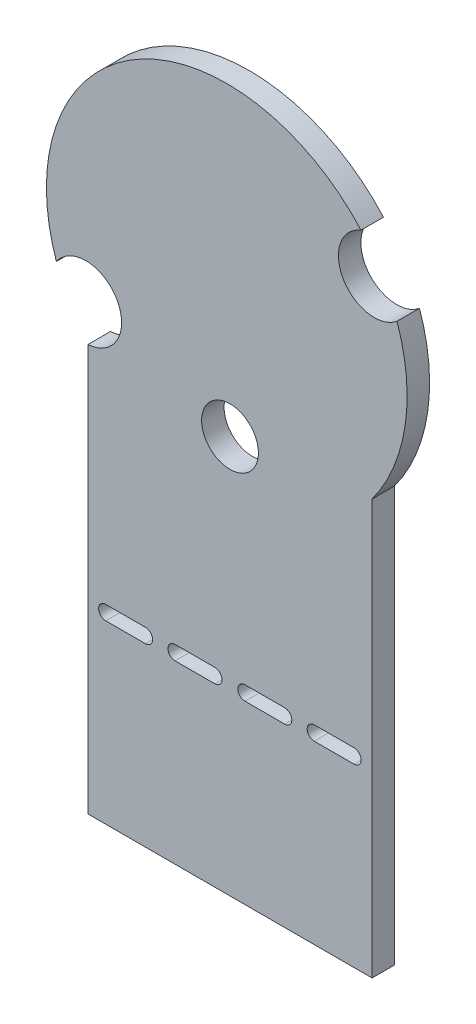
ISO-10303-21;
HEADER;
FILE_DESCRIPTION(('STEP AP214'),'2;1');
FILE_NAME('part.step','',(''),(''),'','','');
FILE_SCHEMA(('AUTOMOTIVE_DESIGN { 1 0 10303 214 1 1 1 1 }'));
ENDSEC;
DATA;
#1=APPLICATION_CONTEXT('core data for automotive mechanical design processes');
#2=APPLICATION_PROTOCOL_DEFINITION('international standard','automotive_design',2000,#1);
#3=PRODUCT_CONTEXT('',#1,'mechanical');
#4=PRODUCT('Part','Part','',(#3));
#5=PRODUCT_RELATED_PRODUCT_CATEGORY('part','',(#4));
#6=PRODUCT_DEFINITION_FORMATION('','',#4);
#7=PRODUCT_DEFINITION_CONTEXT('part definition',#1,'design');
#8=PRODUCT_DEFINITION('design','',#6,#7);
#9=PRODUCT_DEFINITION_SHAPE('','',#8);
#10=(LENGTH_UNIT() NAMED_UNIT(*) SI_UNIT(.MILLI.,.METRE.));
#11=(NAMED_UNIT(*) PLANE_ANGLE_UNIT() SI_UNIT($,.RADIAN.));
#12=(NAMED_UNIT(*) SI_UNIT($,.STERADIAN.) SOLID_ANGLE_UNIT());
#13=UNCERTAINTY_MEASURE_WITH_UNIT(LENGTH_MEASURE(1.E-05),#10,'distance_accuracy_value','');
#14=(GEOMETRIC_REPRESENTATION_CONTEXT(3) GLOBAL_UNCERTAINTY_ASSIGNED_CONTEXT((#13)) GLOBAL_UNIT_ASSIGNED_CONTEXT((#10,
#11,#12)) REPRESENTATION_CONTEXT('',''));
#15=CARTESIAN_POINT('',(0.,0.,0.));
#16=DIRECTION('',(0.,0.,1.));
#17=DIRECTION('',(1.,0.,0.));
#18=AXIS2_PLACEMENT_3D('',#15,#16,#17);
#19=CARTESIAN_POINT('',(100.144566,-105.536604,0.));
#20=DIRECTION('',(0.,0.,-1.));
#21=DIRECTION('',(1.,0.,0.));
#22=AXIS2_PLACEMENT_3D('',#19,#20,#21);
#23=CYLINDRICAL_SURFACE('',#22,1.27);
#24=DIRECTION('',(0.,0.,1.));
#25=VECTOR('',#24,1.);
#26=CARTESIAN_POINT('',(101.414566,-105.536604,0.));
#27=LINE('',#26,#25);
#28=CARTESIAN_POINT('',(101.414566,-105.536604,0.));
#29=VERTEX_POINT('',#28);
#30=CARTESIAN_POINT('',(101.414566,-105.536604,1.0044));
#31=VERTEX_POINT('',#30);
#32=EDGE_CURVE('E11',#29,#31,#27,.T.);
#33=ORIENTED_EDGE('',*,*,#32,.T.);
#34=CARTESIAN_POINT('',(100.144566,-105.536604,1.0044));
#35=DIRECTION('',(0.,0.,1.));
#36=DIRECTION('',(1.,0.,0.));
#37=AXIS2_PLACEMENT_3D('',#34,#35,#36);
#38=CIRCLE('',#37,1.27);
#39=EDGE_CURVE('E342',#31,#31,#38,.T.);
#40=ORIENTED_EDGE('',*,*,#39,.T.);
#41=ORIENTED_EDGE('',*,*,#32,.F.);
#42=CARTESIAN_POINT('',(100.144566,-105.536604,0.));
#43=DIRECTION('',(0.,0.,1.));
#44=DIRECTION('',(1.,0.,0.));
#45=AXIS2_PLACEMENT_3D('',#42,#43,#44);
#46=CIRCLE('',#45,1.27);
#47=EDGE_CURVE('E394',#29,#29,#46,.T.);
#48=ORIENTED_EDGE('',*,*,#47,.F.);
#49=EDGE_LOOP('',(#33,#40,#41,#48));
#50=FACE_BOUND('',#49,.T.);
#51=ADVANCED_FACE('F16',(#50),#23,.F.);
#52=CARTESIAN_POINT('',(94.5896,-115.443,0.));
#53=DIRECTION('',(0.,1.,0.));
#54=DIRECTION('',(1.,0.,0.));
#55=AXIS2_PLACEMENT_3D('',#52,#53,#54);
#56=PLANE('',#55);
#57=DIRECTION('',(0.,0.,1.));
#58=VECTOR('',#57,1.);
#59=CARTESIAN_POINT('',(94.5896,-115.443,0.));
#60=LINE('',#59,#58);
#61=CARTESIAN_POINT('',(94.5896,-115.443,0.));
#62=VERTEX_POINT('',#61);
#63=CARTESIAN_POINT('',(94.5896,-115.443,1.0044));
#64=VERTEX_POINT('',#63);
#65=EDGE_CURVE('E344',#62,#64,#60,.T.);
#66=ORIENTED_EDGE('',*,*,#65,.T.);
#67=DIRECTION('',(1.,0.,0.));
#68=VECTOR('',#67,1.);
#69=CARTESIAN_POINT('',(94.5896,-115.443,1.0044));
#70=LINE('',#69,#68);
#71=CARTESIAN_POINT('',(96.3676,-115.443,1.0044));
#72=VERTEX_POINT('',#71);
#73=EDGE_CURVE('E343',#64,#72,#70,.T.);
#74=ORIENTED_EDGE('',*,*,#73,.T.);
#75=DIRECTION('',(0.,0.,1.));
#76=VECTOR('',#75,1.);
#77=CARTESIAN_POINT('',(96.3676,-115.443,0.));
#78=LINE('',#77,#76);
#79=CARTESIAN_POINT('',(96.3676,-115.443,0.));
#80=VERTEX_POINT('',#79);
#81=EDGE_CURVE('E29',#80,#72,#78,.T.);
#82=ORIENTED_EDGE('',*,*,#81,.F.);
#83=DIRECTION('',(1.,0.,0.));
#84=VECTOR('',#83,1.);
#85=CARTESIAN_POINT('',(94.5896,-115.443,0.));
#86=LINE('',#85,#84);
#87=EDGE_CURVE('E337',#62,#80,#86,.T.);
#88=ORIENTED_EDGE('',*,*,#87,.F.);
#89=EDGE_LOOP('',(#66,#74,#82,#88));
#90=FACE_BOUND('',#89,.T.);
#91=ADVANCED_FACE('F535',(#90),#56,.T.);
#92=CARTESIAN_POINT('',(96.3676,-115.1255,0.));
#93=DIRECTION('',(0.,0.,-1.));
#94=DIRECTION('',(1.,0.,0.));
#95=AXIS2_PLACEMENT_3D('',#92,#93,#94);
#96=CYLINDRICAL_SURFACE('',#95,0.3175);
#97=ORIENTED_EDGE('',*,*,#81,.T.);
#98=CARTESIAN_POINT('',(96.3676,-115.1255,1.0044));
#99=DIRECTION('',(0.,0.,1.));
#100=DIRECTION('',(1.,0.,0.));
#101=AXIS2_PLACEMENT_3D('',#98,#99,#100);
#102=CIRCLE('',#101,0.3175);
#103=CARTESIAN_POINT('',(96.3676,-114.808,1.0044));
#104=VERTEX_POINT('',#103);
#105=EDGE_CURVE('E325',#72,#104,#102,.T.);
#106=ORIENTED_EDGE('',*,*,#105,.T.);
#107=DIRECTION('',(0.,0.,1.));
#108=VECTOR('',#107,1.);
#109=CARTESIAN_POINT('',(96.3676,-114.808,0.));
#110=LINE('',#109,#108);
#111=CARTESIAN_POINT('',(96.3676,-114.808,0.));
#112=VERTEX_POINT('',#111);
#113=EDGE_CURVE('E347',#112,#104,#110,.T.);
#114=ORIENTED_EDGE('',*,*,#113,.F.);
#115=CARTESIAN_POINT('',(96.3676,-115.1255,0.));
#116=DIRECTION('',(0.,0.,1.));
#117=DIRECTION('',(1.,0.,0.));
#118=AXIS2_PLACEMENT_3D('',#115,#116,#117);
#119=CIRCLE('',#118,0.3175);
#120=EDGE_CURVE('E332',#80,#112,#119,.T.);
#121=ORIENTED_EDGE('',*,*,#120,.F.);
#122=EDGE_LOOP('',(#97,#106,#114,#121));
#123=FACE_BOUND('',#122,.T.);
#124=ADVANCED_FACE('F526',(#123),#96,.F.);
#125=CARTESIAN_POINT('',(96.3676,-114.808,0.));
#126=DIRECTION('',(0.,-1.,0.));
#127=DIRECTION('',(0.,0.,-1.));
#128=AXIS2_PLACEMENT_3D('',#125,#126,#127);
#129=PLANE('',#128);
#130=ORIENTED_EDGE('',*,*,#113,.T.);
#131=DIRECTION('',(-1.,0.,0.));
#132=VECTOR('',#131,1.);
#133=CARTESIAN_POINT('',(96.3676,-114.808,1.0044));
#134=LINE('',#133,#132);
#135=CARTESIAN_POINT('',(94.5896,-114.808,1.0044));
#136=VERTEX_POINT('',#135);
#137=EDGE_CURVE('E321',#104,#136,#134,.T.);
#138=ORIENTED_EDGE('',*,*,#137,.T.);
#139=DIRECTION('',(0.,0.,1.));
#140=VECTOR('',#139,1.);
#141=CARTESIAN_POINT('',(94.5896,-114.808,0.));
#142=LINE('',#141,#140);
#143=CARTESIAN_POINT('',(94.5896,-114.808,0.));
#144=VERTEX_POINT('',#143);
#145=EDGE_CURVE('E302',#144,#136,#142,.T.);
#146=ORIENTED_EDGE('',*,*,#145,.F.);
#147=DIRECTION('',(-1.,0.,0.));
#148=VECTOR('',#147,1.);
#149=CARTESIAN_POINT('',(96.3676,-114.808,0.));
#150=LINE('',#149,#148);
#151=EDGE_CURVE('E336',#112,#144,#150,.T.);
#152=ORIENTED_EDGE('',*,*,#151,.F.);
#153=EDGE_LOOP('',(#130,#138,#146,#152));
#154=FACE_BOUND('',#153,.T.);
#155=ADVANCED_FACE('F522',(#154),#129,.T.);
#156=CARTESIAN_POINT('',(94.5896,-115.1255,0.));
#157=DIRECTION('',(0.,0.,-1.));
#158=DIRECTION('',(1.,0.,0.));
#159=AXIS2_PLACEMENT_3D('',#156,#157,#158);
#160=CYLINDRICAL_SURFACE('',#159,0.3175);
#161=ORIENTED_EDGE('',*,*,#145,.T.);
#162=CARTESIAN_POINT('',(94.5896,-115.1255,1.0044));
#163=DIRECTION('',(0.,0.,1.));
#164=DIRECTION('',(1.,0.,0.));
#165=AXIS2_PLACEMENT_3D('',#162,#163,#164);
#166=CIRCLE('',#165,0.3175);
#167=EDGE_CURVE('E338',#136,#64,#166,.T.);
#168=ORIENTED_EDGE('',*,*,#167,.T.);
#169=ORIENTED_EDGE('',*,*,#65,.F.);
#170=CARTESIAN_POINT('',(94.5896,-115.1255,0.));
#171=DIRECTION('',(0.,0.,1.));
#172=DIRECTION('',(1.,0.,0.));
#173=AXIS2_PLACEMENT_3D('',#170,#171,#172);
#174=CIRCLE('',#173,0.3175);
#175=EDGE_CURVE('E356',#144,#62,#174,.T.);
#176=ORIENTED_EDGE('',*,*,#175,.F.);
#177=EDGE_LOOP('',(#161,#168,#169,#176));
#178=FACE_BOUND('',#177,.T.);
#179=ADVANCED_FACE('F519',(#178),#160,.F.);
#180=CARTESIAN_POINT('',(99.4664,-115.1255,0.));
#181=DIRECTION('',(0.,0.,-1.));
#182=DIRECTION('',(1.,0.,0.));
#183=AXIS2_PLACEMENT_3D('',#180,#181,#182);
#184=CYLINDRICAL_SURFACE('',#183,0.3175);
#185=DIRECTION('',(0.,0.,1.));
#186=VECTOR('',#185,1.);
#187=CARTESIAN_POINT('',(99.4664,-115.443,0.));
#188=LINE('',#187,#186);
#189=CARTESIAN_POINT('',(99.4664,-115.443,0.));
#190=VERTEX_POINT('',#189);
#191=CARTESIAN_POINT('',(99.4664,-115.443,1.0044));
#192=VERTEX_POINT('',#191);
#193=EDGE_CURVE('E213',#190,#192,#188,.T.);
#194=ORIENTED_EDGE('',*,*,#193,.T.);
#195=CARTESIAN_POINT('',(99.4664,-115.1255,1.0044));
#196=DIRECTION('',(0.,0.,1.));
#197=DIRECTION('',(1.,0.,0.));
#198=AXIS2_PLACEMENT_3D('',#195,#196,#197);
#199=CIRCLE('',#198,0.3175);
#200=CARTESIAN_POINT('',(99.4664,-114.808,1.0044));
#201=VERTEX_POINT('',#200);
#202=EDGE_CURVE('E405',#192,#201,#199,.T.);
#203=ORIENTED_EDGE('',*,*,#202,.T.);
#204=DIRECTION('',(0.,0.,1.));
#205=VECTOR('',#204,1.);
#206=CARTESIAN_POINT('',(99.4664,-114.808,0.));
#207=LINE('',#206,#205);
#208=CARTESIAN_POINT('',(99.4664,-114.808,0.));
#209=VERTEX_POINT('',#208);
#210=EDGE_CURVE('E299',#209,#201,#207,.T.);
#211=ORIENTED_EDGE('',*,*,#210,.F.);
#212=CARTESIAN_POINT('',(99.4664,-115.1255,0.));
#213=DIRECTION('',(0.,0.,1.));
#214=DIRECTION('',(1.,0.,0.));
#215=AXIS2_PLACEMENT_3D('',#212,#213,#214);
#216=CIRCLE('',#215,0.3175);
#217=EDGE_CURVE('E304',#190,#209,#216,.T.);
#218=ORIENTED_EDGE('',*,*,#217,.F.);
#219=EDGE_LOOP('',(#194,#203,#211,#218));
#220=FACE_BOUND('',#219,.T.);
#221=ADVANCED_FACE('F18',(#220),#184,.F.);
#222=CARTESIAN_POINT('',(99.4664,-114.808,0.));
#223=DIRECTION('',(0.,-1.,0.));
#224=DIRECTION('',(0.,0.,-1.));
#225=AXIS2_PLACEMENT_3D('',#222,#223,#224);
#226=PLANE('',#225);
#227=ORIENTED_EDGE('',*,*,#210,.T.);
#228=DIRECTION('',(-1.,0.,0.));
#229=VECTOR('',#228,1.);
#230=CARTESIAN_POINT('',(99.4664,-114.808,1.0044));
#231=LINE('',#230,#229);
#232=CARTESIAN_POINT('',(97.6884,-114.808,1.0044));
#233=VERTEX_POINT('',#232);
#234=EDGE_CURVE('E401',#201,#233,#231,.T.);
#235=ORIENTED_EDGE('',*,*,#234,.T.);
#236=DIRECTION('',(0.,0.,1.));
#237=VECTOR('',#236,1.);
#238=CARTESIAN_POINT('',(97.6884,-114.808,0.));
#239=LINE('',#238,#237);
#240=CARTESIAN_POINT('',(97.6884,-114.808,0.));
#241=VERTEX_POINT('',#240);
#242=EDGE_CURVE('E303',#241,#233,#239,.T.);
#243=ORIENTED_EDGE('',*,*,#242,.F.);
#244=DIRECTION('',(-1.,0.,0.));
#245=VECTOR('',#244,1.);
#246=CARTESIAN_POINT('',(99.4664,-114.808,0.));
#247=LINE('',#246,#245);
#248=EDGE_CURVE('E308',#209,#241,#247,.T.);
#249=ORIENTED_EDGE('',*,*,#248,.F.);
#250=EDGE_LOOP('',(#227,#235,#243,#249));
#251=FACE_BOUND('',#250,.T.);
#252=ADVANCED_FACE('F507',(#251),#226,.T.);
#253=CARTESIAN_POINT('',(97.6884,-115.1255,0.));
#254=DIRECTION('',(0.,0.,-1.));
#255=DIRECTION('',(1.,0.,0.));
#256=AXIS2_PLACEMENT_3D('',#253,#254,#255);
#257=CYLINDRICAL_SURFACE('',#256,0.3175);
#258=ORIENTED_EDGE('',*,*,#242,.T.);
#259=CARTESIAN_POINT('',(97.6884,-115.1255,1.0044));
#260=DIRECTION('',(0.,0.,1.));
#261=DIRECTION('',(1.,0.,0.));
#262=AXIS2_PLACEMENT_3D('',#259,#260,#261);
#263=CIRCLE('',#262,0.3175);
#264=CARTESIAN_POINT('',(97.6884,-115.443,1.0044));
#265=VERTEX_POINT('',#264);
#266=EDGE_CURVE('E406',#233,#265,#263,.T.);
#267=ORIENTED_EDGE('',*,*,#266,.T.);
#268=DIRECTION('',(0.,0.,1.));
#269=VECTOR('',#268,1.);
#270=CARTESIAN_POINT('',(97.6884,-115.443,0.));
#271=LINE('',#270,#269);
#272=CARTESIAN_POINT('',(97.6884,-115.443,0.));
#273=VERTEX_POINT('',#272);
#274=EDGE_CURVE('E224',#273,#265,#271,.T.);
#275=ORIENTED_EDGE('',*,*,#274,.F.);
#276=CARTESIAN_POINT('',(97.6884,-115.1255,0.));
#277=DIRECTION('',(0.,0.,1.));
#278=DIRECTION('',(1.,0.,0.));
#279=AXIS2_PLACEMENT_3D('',#276,#277,#278);
#280=CIRCLE('',#279,0.3175);
#281=EDGE_CURVE('E360',#241,#273,#280,.T.);
#282=ORIENTED_EDGE('',*,*,#281,.F.);
#283=EDGE_LOOP('',(#258,#267,#275,#282));
#284=FACE_BOUND('',#283,.T.);
#285=ADVANCED_FACE('F599',(#284),#257,.F.);
#286=CARTESIAN_POINT('',(97.6884,-115.443,0.));
#287=DIRECTION('',(0.,1.,0.));
#288=DIRECTION('',(1.,0.,0.));
#289=AXIS2_PLACEMENT_3D('',#286,#287,#288);
#290=PLANE('',#289);
#291=ORIENTED_EDGE('',*,*,#274,.T.);
#292=DIRECTION('',(1.,0.,0.));
#293=VECTOR('',#292,1.);
#294=CARTESIAN_POINT('',(97.6884,-115.443,1.0044));
#295=LINE('',#294,#293);
#296=EDGE_CURVE('E326',#265,#192,#295,.T.);
#297=ORIENTED_EDGE('',*,*,#296,.T.);
#298=ORIENTED_EDGE('',*,*,#193,.F.);
#299=DIRECTION('',(1.,0.,0.));
#300=VECTOR('',#299,1.);
#301=CARTESIAN_POINT('',(97.6884,-115.443,0.));
#302=LINE('',#301,#300);
#303=EDGE_CURVE('E309',#273,#190,#302,.T.);
#304=ORIENTED_EDGE('',*,*,#303,.F.);
#305=EDGE_LOOP('',(#291,#297,#298,#304));
#306=FACE_BOUND('',#305,.T.);
#307=ADVANCED_FACE('F593',(#306),#290,.T.);
#308=CARTESIAN_POINT('',(100.8126,-115.1255,0.));
#309=DIRECTION('',(0.,0.,-1.));
#310=DIRECTION('',(1.,0.,0.));
#311=AXIS2_PLACEMENT_3D('',#308,#309,#310);
#312=CYLINDRICAL_SURFACE('',#311,0.3175);
#313=DIRECTION('',(0.,0.,1.));
#314=VECTOR('',#313,1.);
#315=CARTESIAN_POINT('',(100.8126,-114.808,0.));
#316=LINE('',#315,#314);
#317=CARTESIAN_POINT('',(100.8126,-114.808,0.));
#318=VERTEX_POINT('',#317);
#319=CARTESIAN_POINT('',(100.8126,-114.808,1.0044));
#320=VERTEX_POINT('',#319);
#321=EDGE_CURVE('E283',#318,#320,#316,.T.);
#322=ORIENTED_EDGE('',*,*,#321,.T.);
#323=CARTESIAN_POINT('',(100.8126,-115.1255,1.0044));
#324=DIRECTION('',(0.,0.,1.));
#325=DIRECTION('',(1.,0.,0.));
#326=AXIS2_PLACEMENT_3D('',#323,#324,#325);
#327=CIRCLE('',#326,0.3175);
#328=CARTESIAN_POINT('',(100.8126,-115.443,1.0044));
#329=VERTEX_POINT('',#328);
#330=EDGE_CURVE('E244',#320,#329,#327,.T.);
#331=ORIENTED_EDGE('',*,*,#330,.T.);
#332=DIRECTION('',(0.,0.,1.));
#333=VECTOR('',#332,1.);
#334=CARTESIAN_POINT('',(100.8126,-115.443,0.));
#335=LINE('',#334,#333);
#336=CARTESIAN_POINT('',(100.8126,-115.443,0.));
#337=VERTEX_POINT('',#336);
#338=EDGE_CURVE('E237',#337,#329,#335,.T.);
#339=ORIENTED_EDGE('',*,*,#338,.F.);
#340=CARTESIAN_POINT('',(100.8126,-115.1255,0.));
#341=DIRECTION('',(0.,0.,1.));
#342=DIRECTION('',(1.,0.,0.));
#343=AXIS2_PLACEMENT_3D('',#340,#341,#342);
#344=CIRCLE('',#343,0.3175);
#345=EDGE_CURVE('E241',#318,#337,#344,.T.);
#346=ORIENTED_EDGE('',*,*,#345,.F.);
#347=EDGE_LOOP('',(#322,#331,#339,#346));
#348=FACE_BOUND('',#347,.T.);
#349=ADVANCED_FACE('F239',(#348),#312,.F.);
#350=CARTESIAN_POINT('',(102.5906,-115.443,0.));
#351=DIRECTION('',(0.,-1.,0.));
#352=DIRECTION('',(0.,0.,-1.));
#353=AXIS2_PLACEMENT_3D('',#350,#351,#352);
#354=PLANE('',#353);
#355=DIRECTION('',(-1.,0.,0.));
#356=VECTOR('',#355,1.);
#357=CARTESIAN_POINT('',(102.5906,-115.443,0.));
#358=LINE('',#357,#356);
#359=CARTESIAN_POINT('',(102.5906,-115.443,0.));
#360=VERTEX_POINT('',#359);
#361=EDGE_CURVE('E252',#360,#337,#358,.T.);
#362=ORIENTED_EDGE('',*,*,#361,.T.);
#363=ORIENTED_EDGE('',*,*,#338,.T.);
#364=DIRECTION('',(-1.,0.,0.));
#365=VECTOR('',#364,1.);
#366=CARTESIAN_POINT('',(102.5906,-115.443,1.0044));
#367=LINE('',#366,#365);
#368=CARTESIAN_POINT('',(102.5906,-115.443,1.0044));
#369=VERTEX_POINT('',#368);
#370=EDGE_CURVE('E355',#369,#329,#367,.T.);
#371=ORIENTED_EDGE('',*,*,#370,.F.);
#372=DIRECTION('',(0.,0.,1.));
#373=VECTOR('',#372,1.);
#374=CARTESIAN_POINT('',(102.5906,-115.443,0.));
#375=LINE('',#374,#373);
#376=EDGE_CURVE('E249',#360,#369,#375,.T.);
#377=ORIENTED_EDGE('',*,*,#376,.F.);
#378=EDGE_LOOP('',(#362,#363,#371,#377));
#379=FACE_BOUND('',#378,.T.);
#380=ADVANCED_FACE('F253',(#379),#354,.F.);
#381=CARTESIAN_POINT('',(102.5906,-115.1255,0.));
#382=DIRECTION('',(0.,0.,-1.));
#383=DIRECTION('',(1.,0.,0.));
#384=AXIS2_PLACEMENT_3D('',#381,#382,#383);
#385=CYLINDRICAL_SURFACE('',#384,0.3175);
#386=ORIENTED_EDGE('',*,*,#376,.T.);
#387=CARTESIAN_POINT('',(102.5906,-115.1255,1.0044));
#388=DIRECTION('',(0.,0.,1.));
#389=DIRECTION('',(1.,0.,0.));
#390=AXIS2_PLACEMENT_3D('',#387,#388,#389);
#391=CIRCLE('',#390,0.3175);
#392=CARTESIAN_POINT('',(102.5906,-114.808,1.0044));
#393=VERTEX_POINT('',#392);
#394=EDGE_CURVE('E416',#369,#393,#391,.T.);
#395=ORIENTED_EDGE('',*,*,#394,.T.);
#396=DIRECTION('',(0.,0.,1.));
#397=VECTOR('',#396,1.);
#398=CARTESIAN_POINT('',(102.5906,-114.808,0.));
#399=LINE('',#398,#397);
#400=CARTESIAN_POINT('',(102.5906,-114.808,0.));
#401=VERTEX_POINT('',#400);
#402=EDGE_CURVE('E279',#401,#393,#399,.T.);
#403=ORIENTED_EDGE('',*,*,#402,.F.);
#404=CARTESIAN_POINT('',(102.5906,-115.1255,0.));
#405=DIRECTION('',(0.,0.,1.));
#406=DIRECTION('',(1.,0.,0.));
#407=AXIS2_PLACEMENT_3D('',#404,#405,#406);
#408=CIRCLE('',#407,0.3175);
#409=EDGE_CURVE('E258',#360,#401,#408,.T.);
#410=ORIENTED_EDGE('',*,*,#409,.F.);
#411=EDGE_LOOP('',(#386,#395,#403,#410));
#412=FACE_BOUND('',#411,.T.);
#413=ADVANCED_FACE('F623',(#412),#385,.F.);
#414=CARTESIAN_POINT('',(100.8126,-114.808,0.));
#415=DIRECTION('',(0.,1.,0.));
#416=DIRECTION('',(1.,0.,0.));
#417=AXIS2_PLACEMENT_3D('',#414,#415,#416);
#418=PLANE('',#417);
#419=DIRECTION('',(1.,0.,0.));
#420=VECTOR('',#419,1.);
#421=CARTESIAN_POINT('',(100.8126,-114.808,0.));
#422=LINE('',#421,#420);
#423=EDGE_CURVE('E263',#318,#401,#422,.T.);
#424=ORIENTED_EDGE('',*,*,#423,.T.);
#425=ORIENTED_EDGE('',*,*,#402,.T.);
#426=DIRECTION('',(1.,0.,0.));
#427=VECTOR('',#426,1.);
#428=CARTESIAN_POINT('',(100.8126,-114.808,1.0044));
#429=LINE('',#428,#427);
#430=EDGE_CURVE('E354',#320,#393,#429,.T.);
#431=ORIENTED_EDGE('',*,*,#430,.F.);
#432=ORIENTED_EDGE('',*,*,#321,.F.);
#433=EDGE_LOOP('',(#424,#425,#431,#432));
#434=FACE_BOUND('',#433,.T.);
#435=ADVANCED_FACE('F517',(#434),#418,.F.);
#436=CARTESIAN_POINT('',(103.9114,-115.1255,0.));
#437=DIRECTION('',(0.,0.,-1.));
#438=DIRECTION('',(1.,0.,0.));
#439=AXIS2_PLACEMENT_3D('',#436,#437,#438);
#440=CYLINDRICAL_SURFACE('',#439,0.3175);
#441=DIRECTION('',(0.,0.,1.));
#442=VECTOR('',#441,1.);
#443=CARTESIAN_POINT('',(103.9114,-114.808,0.));
#444=LINE('',#443,#442);
#445=CARTESIAN_POINT('',(103.9114,-114.808,0.));
#446=VERTEX_POINT('',#445);
#447=CARTESIAN_POINT('',(103.9114,-114.808,1.0044));
#448=VERTEX_POINT('',#447);
#449=EDGE_CURVE('E369',#446,#448,#444,.T.);
#450=ORIENTED_EDGE('',*,*,#449,.T.);
#451=CARTESIAN_POINT('',(103.9114,-115.1255,1.0044));
#452=DIRECTION('',(0.,0.,1.));
#453=DIRECTION('',(1.,0.,0.));
#454=AXIS2_PLACEMENT_3D('',#451,#452,#453);
#455=CIRCLE('',#454,0.3175);
#456=CARTESIAN_POINT('',(103.9114,-115.443,1.0044));
#457=VERTEX_POINT('',#456);
#458=EDGE_CURVE('E417',#448,#457,#455,.T.);
#459=ORIENTED_EDGE('',*,*,#458,.T.);
#460=DIRECTION('',(0.,0.,1.));
#461=VECTOR('',#460,1.);
#462=CARTESIAN_POINT('',(103.9114,-115.443,0.));
#463=LINE('',#462,#461);
#464=CARTESIAN_POINT('',(103.9114,-115.443,0.));
#465=VERTEX_POINT('',#464);
#466=EDGE_CURVE('E276',#465,#457,#463,.T.);
#467=ORIENTED_EDGE('',*,*,#466,.F.);
#468=CARTESIAN_POINT('',(103.9114,-115.1255,0.));
#469=DIRECTION('',(0.,0.,1.));
#470=DIRECTION('',(1.,0.,0.));
#471=AXIS2_PLACEMENT_3D('',#468,#469,#470);
#472=CIRCLE('',#471,0.3175);
#473=EDGE_CURVE('E331',#446,#465,#472,.T.);
#474=ORIENTED_EDGE('',*,*,#473,.F.);
#475=EDGE_LOOP('',(#450,#459,#467,#474));
#476=FACE_BOUND('',#475,.T.);
#477=ADVANCED_FACE('F513',(#476),#440,.F.);
#478=CARTESIAN_POINT('',(103.9114,-115.443,0.));
#479=DIRECTION('',(0.,1.,0.));
#480=DIRECTION('',(1.,0.,0.));
#481=AXIS2_PLACEMENT_3D('',#478,#479,#480);
#482=PLANE('',#481);
#483=ORIENTED_EDGE('',*,*,#466,.T.);
#484=DIRECTION('',(1.,0.,0.));
#485=VECTOR('',#484,1.);
#486=CARTESIAN_POINT('',(103.9114,-115.443,1.0044));
#487=LINE('',#486,#485);
#488=CARTESIAN_POINT('',(105.6894,-115.443,1.0044));
#489=VERTEX_POINT('',#488);
#490=EDGE_CURVE('E422',#457,#489,#487,.T.);
#491=ORIENTED_EDGE('',*,*,#490,.T.);
#492=DIRECTION('',(0.,0.,1.));
#493=VECTOR('',#492,1.);
#494=CARTESIAN_POINT('',(105.6894,-115.443,0.));
#495=LINE('',#494,#493);
#496=CARTESIAN_POINT('',(105.6894,-115.443,0.));
#497=VERTEX_POINT('',#496);
#498=EDGE_CURVE('E280',#497,#489,#495,.T.);
#499=ORIENTED_EDGE('',*,*,#498,.F.);
#500=DIRECTION('',(1.,0.,0.));
#501=VECTOR('',#500,1.);
#502=CARTESIAN_POINT('',(103.9114,-115.443,0.));
#503=LINE('',#502,#501);
#504=EDGE_CURVE('E327',#465,#497,#503,.T.);
#505=ORIENTED_EDGE('',*,*,#504,.F.);
#506=EDGE_LOOP('',(#483,#491,#499,#505));
#507=FACE_BOUND('',#506,.T.);
#508=ADVANCED_FACE('F509',(#507),#482,.T.);
#509=CARTESIAN_POINT('',(105.6894,-115.1255,0.));
#510=DIRECTION('',(0.,0.,-1.));
#511=DIRECTION('',(1.,0.,0.));
#512=AXIS2_PLACEMENT_3D('',#509,#510,#511);
#513=CYLINDRICAL_SURFACE('',#512,0.3175);
#514=ORIENTED_EDGE('',*,*,#498,.T.);
#515=CARTESIAN_POINT('',(105.6894,-115.1255,1.0044));
#516=DIRECTION('',(0.,0.,1.));
#517=DIRECTION('',(1.,0.,0.));
#518=AXIS2_PLACEMENT_3D('',#515,#516,#517);
#519=CIRCLE('',#518,0.3175);
#520=CARTESIAN_POINT('',(105.6894,-114.808,1.0044));
#521=VERTEX_POINT('',#520);
#522=EDGE_CURVE('E286',#489,#521,#519,.T.);
#523=ORIENTED_EDGE('',*,*,#522,.T.);
#524=DIRECTION('',(0.,0.,1.));
#525=VECTOR('',#524,1.);
#526=CARTESIAN_POINT('',(105.6894,-114.808,0.));
#527=LINE('',#526,#525);
#528=CARTESIAN_POINT('',(105.6894,-114.808,0.));
#529=VERTEX_POINT('',#528);
#530=EDGE_CURVE('E274',#529,#521,#527,.T.);
#531=ORIENTED_EDGE('',*,*,#530,.F.);
#532=CARTESIAN_POINT('',(105.6894,-115.1255,0.));
#533=DIRECTION('',(0.,0.,1.));
#534=DIRECTION('',(1.,0.,0.));
#535=AXIS2_PLACEMENT_3D('',#532,#533,#534);
#536=CIRCLE('',#535,0.3175);
#537=EDGE_CURVE('E270',#497,#529,#536,.T.);
#538=ORIENTED_EDGE('',*,*,#537,.F.);
#539=EDGE_LOOP('',(#514,#523,#531,#538));
#540=FACE_BOUND('',#539,.T.);
#541=ADVANCED_FACE('F512',(#540),#513,.F.);
#542=CARTESIAN_POINT('',(105.6894,-114.808,0.));
#543=DIRECTION('',(0.,-1.,0.));
#544=DIRECTION('',(0.,0.,-1.));
#545=AXIS2_PLACEMENT_3D('',#542,#543,#544);
#546=PLANE('',#545);
#547=ORIENTED_EDGE('',*,*,#530,.T.);
#548=DIRECTION('',(-1.,0.,0.));
#549=VECTOR('',#548,1.);
#550=CARTESIAN_POINT('',(105.6894,-114.808,1.0044));
#551=LINE('',#550,#549);
#552=EDGE_CURVE('E421',#521,#448,#551,.T.);
#553=ORIENTED_EDGE('',*,*,#552,.T.);
#554=ORIENTED_EDGE('',*,*,#449,.F.);
#555=DIRECTION('',(-1.,0.,0.));
#556=VECTOR('',#555,1.);
#557=CARTESIAN_POINT('',(105.6894,-114.808,0.));
#558=LINE('',#557,#556);
#559=EDGE_CURVE('E351',#529,#446,#558,.T.);
#560=ORIENTED_EDGE('',*,*,#559,.F.);
#561=EDGE_LOOP('',(#547,#553,#554,#560));
#562=FACE_BOUND('',#561,.T.);
#563=ADVANCED_FACE('F528',(#562),#546,.T.);
#564=CARTESIAN_POINT('',(106.494566,-123.317,0.));
#565=DIRECTION('',(0.,-1.,0.));
#566=DIRECTION('',(0.,0.,-1.));
#567=AXIS2_PLACEMENT_3D('',#564,#565,#566);
#568=PLANE('',#567);
#569=DIRECTION('',(0.,0.,1.));
#570=VECTOR('',#569,1.);
#571=CARTESIAN_POINT('',(106.494566,-123.317,0.));
#572=LINE('',#571,#570);
#573=CARTESIAN_POINT('',(106.494566,-123.317,0.));
#574=VERTEX_POINT('',#573);
#575=CARTESIAN_POINT('',(106.494566,-123.317,1.0044));
#576=VERTEX_POINT('',#575);
#577=EDGE_CURVE('E293',#574,#576,#572,.T.);
#578=ORIENTED_EDGE('',*,*,#577,.T.);
#579=DIRECTION('',(-1.,0.,0.));
#580=VECTOR('',#579,1.);
#581=CARTESIAN_POINT('',(106.494566,-123.317,1.0044));
#582=LINE('',#581,#580);
#583=CARTESIAN_POINT('',(93.794566,-123.317,1.0044));
#584=VERTEX_POINT('',#583);
#585=EDGE_CURVE('E287',#576,#584,#582,.T.);
#586=ORIENTED_EDGE('',*,*,#585,.T.);
#587=DIRECTION('',(0.,0.,1.));
#588=VECTOR('',#587,1.);
#589=CARTESIAN_POINT('',(93.794566,-123.317,0.));
#590=LINE('',#589,#588);
#591=CARTESIAN_POINT('',(93.794566,-123.317,0.));
#592=VERTEX_POINT('',#591);
#593=EDGE_CURVE('E290',#592,#584,#590,.T.);
#594=ORIENTED_EDGE('',*,*,#593,.F.);
#595=DIRECTION('',(-1.,0.,0.));
#596=VECTOR('',#595,1.);
#597=CARTESIAN_POINT('',(106.494566,-123.317,0.));
#598=LINE('',#597,#596);
#599=EDGE_CURVE('E294',#574,#592,#598,.T.);
#600=ORIENTED_EDGE('',*,*,#599,.F.);
#601=EDGE_LOOP('',(#578,#586,#594,#600));
#602=FACE_BOUND('',#601,.T.);
#603=ADVANCED_FACE('F531',(#602),#568,.T.);
#604=CARTESIAN_POINT('',(93.794566,-123.317,0.));
#605=DIRECTION('',(-1.,0.,0.));
#606=DIRECTION('',(0.,0.,1.));
#607=AXIS2_PLACEMENT_3D('',#604,#605,#606);
#608=PLANE('',#607);
#609=ORIENTED_EDGE('',*,*,#593,.T.);
#610=DIRECTION('',(0.,1.,0.));
#611=VECTOR('',#610,1.);
#612=CARTESIAN_POINT('',(93.794566,-123.317,1.0044));
#613=LINE('',#612,#611);
#614=CARTESIAN_POINT('',(93.794566,-105.144777,1.0044));
#615=VERTEX_POINT('',#614);
#616=EDGE_CURVE('E426',#584,#615,#613,.T.);
#617=ORIENTED_EDGE('',*,*,#616,.T.);
#618=CARTESIAN_POINT('',(93.7945653025838,-105.14476529276,0.));
#619=DIRECTION('',(0.,0.,1.));
#620=VECTOR('',#619,1.);
#621=LINE('',#618,#620);
#622=CARTESIAN_POINT('',(93.794566,-105.144777,0.));
#623=VERTEX_POINT('',#622);
#624=EDGE_CURVE('E383',#623,#615,#621,.T.);
#625=ORIENTED_EDGE('',*,*,#624,.F.);
#626=DIRECTION('',(0.,1.,0.));
#627=VECTOR('',#626,1.);
#628=CARTESIAN_POINT('',(93.794566,-123.317,0.));
#629=LINE('',#628,#627);
#630=EDGE_CURVE('E297',#592,#623,#629,.T.);
#631=ORIENTED_EDGE('',*,*,#630,.F.);
#632=EDGE_LOOP('',(#609,#617,#625,#631));
#633=FACE_BOUND('',#632,.T.);
#634=ADVANCED_FACE('F633',(#633),#608,.T.);
#635=CARTESIAN_POINT('',(106.49455715676,-104.7745879097,0.));
#636=DIRECTION('',(0.999999999999886,4.76919189080346E-07,0.));
#637=DIRECTION('',(0.,0.,-1.));
#638=AXIS2_PLACEMENT_3D('',#635,#636,#637);
#639=PLANE('',#638);
#640=DIRECTION('',(0.,0.,1.));
#641=VECTOR('',#640,1.);
#642=CARTESIAN_POINT('',(106.49455715676,-104.7745879097,0.));
#643=LINE('',#642,#641);
#644=CARTESIAN_POINT('',(106.49455715676,-104.7745879097,0.));
#645=VERTEX_POINT('',#644);
#646=CARTESIAN_POINT('',(106.49455715676,-104.7745879097,1.0044));
#647=VERTEX_POINT('',#646);
#648=EDGE_CURVE('E319',#645,#647,#643,.T.);
#649=ORIENTED_EDGE('',*,*,#648,.T.);
#650=DIRECTION('',(4.76919189080346E-07,-0.999999999999886,0.));
#651=VECTOR('',#650,1.);
#652=CARTESIAN_POINT('',(106.49455715676,-104.7745879097,1.0044));
#653=LINE('',#652,#651);
#654=EDGE_CURVE('E122',#647,#576,#653,.T.);
#655=ORIENTED_EDGE('',*,*,#654,.T.);
#656=ORIENTED_EDGE('',*,*,#577,.F.);
#657=DIRECTION('',(4.76919189080346E-07,-0.999999999999886,0.));
#658=VECTOR('',#657,1.);
#659=CARTESIAN_POINT('',(106.49455715676,-104.7745879097,0.));
#660=LINE('',#659,#658);
#661=EDGE_CURVE('E133',#645,#574,#660,.T.);
#662=ORIENTED_EDGE('',*,*,#661,.F.);
#663=EDGE_LOOP('',(#649,#655,#656,#662));
#664=FACE_BOUND('',#663,.T.);
#665=ADVANCED_FACE('F506',(#664),#639,.T.);
#666=CARTESIAN_POINT('',(93.69942,-103.5476,0.));
#667=DIRECTION('',(0.,0.,-1.));
#668=DIRECTION('',(1.,0.,0.));
#669=AXIS2_PLACEMENT_3D('',#666,#667,#668);
#670=CYLINDRICAL_SURFACE('',#669,1.599996750309);
#671=ORIENTED_EDGE('',*,*,#624,.T.);
#672=CARTESIAN_POINT('',(93.69942,-103.5476,1.0044));
#673=DIRECTION('',(0.,0.,1.));
#674=DIRECTION('',(1.,0.,0.));
#675=AXIS2_PLACEMENT_3D('',#672,#673,#674);
#676=CIRCLE('',#675,1.599996750309);
#677=CARTESIAN_POINT('',(92.38311,-102.63803,1.0044));
#678=VERTEX_POINT('',#677);
#679=EDGE_CURVE('E398',#615,#678,#676,.T.);
#680=ORIENTED_EDGE('',*,*,#679,.T.);
#681=DIRECTION('',(0.,0.,1.));
#682=VECTOR('',#681,1.);
#683=CARTESIAN_POINT('',(92.38311,-102.63803,0.));
#684=LINE('',#683,#682);
#685=CARTESIAN_POINT('',(92.38311,-102.63803,0.));
#686=VERTEX_POINT('',#685);
#687=EDGE_CURVE('E314',#686,#678,#684,.T.);
#688=ORIENTED_EDGE('',*,*,#687,.F.);
#689=CARTESIAN_POINT('',(93.69942,-103.5476,0.));
#690=DIRECTION('',(0.,0.,1.));
#691=DIRECTION('',(1.,0.,0.));
#692=AXIS2_PLACEMENT_3D('',#689,#690,#691);
#693=CIRCLE('',#692,1.599996750309);
#694=EDGE_CURVE('E366',#623,#686,#693,.T.);
#695=ORIENTED_EDGE('',*,*,#694,.F.);
#696=EDGE_LOOP('',(#671,#680,#688,#695));
#697=FACE_BOUND('',#696,.T.);
#698=ADVANCED_FACE('F495',(#697),#670,.F.);
#699=CARTESIAN_POINT('',(100.07562316028,-108.0958352669,1.0044));
#700=DIRECTION('',(0.,0.,-1.));
#701=DIRECTION('',(0.,-1.,0.));
#702=AXIS2_PLACEMENT_3D('',#699,#700,#701);
#703=PLANE('',#702);
#704=ORIENTED_EDGE('',*,*,#39,.F.);
#705=EDGE_LOOP('',(#704));
#706=FACE_BOUND('',#705,.T.);
#707=ORIENTED_EDGE('',*,*,#137,.F.);
#708=ORIENTED_EDGE('',*,*,#105,.F.);
#709=ORIENTED_EDGE('',*,*,#73,.F.);
#710=ORIENTED_EDGE('',*,*,#167,.F.);
#711=EDGE_LOOP('',(#707,#708,#709,#710));
#712=FACE_BOUND('',#711,.T.);
#713=ORIENTED_EDGE('',*,*,#266,.F.);
#714=ORIENTED_EDGE('',*,*,#234,.F.);
#715=ORIENTED_EDGE('',*,*,#202,.F.);
#716=ORIENTED_EDGE('',*,*,#296,.F.);
#717=EDGE_LOOP('',(#713,#714,#715,#716));
#718=FACE_BOUND('',#717,.T.);
#719=ORIENTED_EDGE('',*,*,#394,.F.);
#720=ORIENTED_EDGE('',*,*,#370,.T.);
#721=ORIENTED_EDGE('',*,*,#330,.F.);
#722=ORIENTED_EDGE('',*,*,#430,.T.);
#723=EDGE_LOOP('',(#719,#720,#721,#722));
#724=FACE_BOUND('',#723,.T.);
#725=ORIENTED_EDGE('',*,*,#522,.F.);
#726=ORIENTED_EDGE('',*,*,#490,.F.);
#727=ORIENTED_EDGE('',*,*,#458,.F.);
#728=ORIENTED_EDGE('',*,*,#552,.F.);
#729=EDGE_LOOP('',(#725,#726,#727,#728));
#730=FACE_BOUND('',#729,.T.);
#731=CARTESIAN_POINT('',(99.99999,-99.99999,1.0044));
#732=DIRECTION('',(0.,0.,1.));
#733=DIRECTION('',(1.,0.,0.));
#734=AXIS2_PLACEMENT_3D('',#731,#732,#733);
#735=CIRCLE('',#734,8.060776387917);
#736=CARTESIAN_POINT('',(106.00065051053,-94.61777954208,1.0044));
#737=VERTEX_POINT('',#736);
#738=EDGE_CURVE('E374',#737,#678,#735,.T.);
#739=ORIENTED_EDGE('',*,*,#738,.T.);
#740=ORIENTED_EDGE('',*,*,#679,.F.);
#741=ORIENTED_EDGE('',*,*,#616,.F.);
#742=ORIENTED_EDGE('',*,*,#585,.F.);
#743=ORIENTED_EDGE('',*,*,#654,.F.);
#744=CARTESIAN_POINT('',(99.99998,-99.99999,1.0044));
#745=DIRECTION('',(0.,0.,1.));
#746=DIRECTION('',(1.,0.,0.));
#747=AXIS2_PLACEMENT_3D('',#744,#745,#746);
#748=CIRCLE('',#747,8.060788897186);
#749=CARTESIAN_POINT('',(107.60883,-97.33884,1.0044));
#750=VERTEX_POINT('',#749);
#751=EDGE_CURVE('E316',#647,#750,#748,.T.);
#752=ORIENTED_EDGE('',*,*,#751,.T.);
#753=CARTESIAN_POINT('',(106.58969,-96.10541,1.0044));
#754=DIRECTION('',(0.,0.,1.));
#755=DIRECTION('',(1.,0.,0.));
#756=AXIS2_PLACEMENT_3D('',#753,#754,#755);
#757=CIRCLE('',#756,1.599998720156);
#758=EDGE_CURVE('E391',#737,#750,#757,.T.);
#759=ORIENTED_EDGE('',*,*,#758,.F.);
#760=EDGE_LOOP('',(#739,#740,#741,#742,#743,#752,#759));
#761=FACE_BOUND('',#760,.T.);
#762=ADVANCED_FACE('F505',(#706,#712,#718,#724,#730,#761),#703,.F.);
#763=CARTESIAN_POINT('',(100.07562316028,-108.0958352669,0.));
#764=DIRECTION('',(0.,0.,-1.));
#765=DIRECTION('',(0.,-1.,0.));
#766=AXIS2_PLACEMENT_3D('',#763,#764,#765);
#767=PLANE('',#766);
#768=ORIENTED_EDGE('',*,*,#47,.T.);
#769=EDGE_LOOP('',(#768));
#770=FACE_BOUND('',#769,.T.);
#771=ORIENTED_EDGE('',*,*,#175,.T.);
#772=ORIENTED_EDGE('',*,*,#87,.T.);
#773=ORIENTED_EDGE('',*,*,#120,.T.);
#774=ORIENTED_EDGE('',*,*,#151,.T.);
#775=EDGE_LOOP('',(#771,#772,#773,#774));
#776=FACE_BOUND('',#775,.T.);
#777=ORIENTED_EDGE('',*,*,#303,.T.);
#778=ORIENTED_EDGE('',*,*,#217,.T.);
#779=ORIENTED_EDGE('',*,*,#248,.T.);
#780=ORIENTED_EDGE('',*,*,#281,.T.);
#781=EDGE_LOOP('',(#777,#778,#779,#780));
#782=FACE_BOUND('',#781,.T.);
#783=ORIENTED_EDGE('',*,*,#423,.F.);
#784=ORIENTED_EDGE('',*,*,#345,.T.);
#785=ORIENTED_EDGE('',*,*,#361,.F.);
#786=ORIENTED_EDGE('',*,*,#409,.T.);
#787=EDGE_LOOP('',(#783,#784,#785,#786));
#788=FACE_BOUND('',#787,.T.);
#789=ORIENTED_EDGE('',*,*,#559,.T.);
#790=ORIENTED_EDGE('',*,*,#473,.T.);
#791=ORIENTED_EDGE('',*,*,#504,.T.);
#792=ORIENTED_EDGE('',*,*,#537,.T.);
#793=EDGE_LOOP('',(#789,#790,#791,#792));
#794=FACE_BOUND('',#793,.T.);
#795=CARTESIAN_POINT('',(106.58969,-96.10541,0.));
#796=DIRECTION('',(0.,0.,1.));
#797=DIRECTION('',(1.,0.,0.));
#798=AXIS2_PLACEMENT_3D('',#795,#796,#797);
#799=CIRCLE('',#798,1.599998720156);
#800=CARTESIAN_POINT('',(106.00065051053,-94.61777954208,0.));
#801=VERTEX_POINT('',#800);
#802=CARTESIAN_POINT('',(107.60883,-97.33884,0.));
#803=VERTEX_POINT('',#802);
#804=EDGE_CURVE('E315',#801,#803,#799,.T.);
#805=ORIENTED_EDGE('',*,*,#804,.T.);
#806=CARTESIAN_POINT('',(99.99998,-99.99999,0.));
#807=DIRECTION('',(0.,0.,1.));
#808=DIRECTION('',(1.,0.,0.));
#809=AXIS2_PLACEMENT_3D('',#806,#807,#808);
#810=CIRCLE('',#809,8.060788897186);
#811=EDGE_CURVE('E320',#645,#803,#810,.T.);
#812=ORIENTED_EDGE('',*,*,#811,.F.);
#813=ORIENTED_EDGE('',*,*,#661,.T.);
#814=ORIENTED_EDGE('',*,*,#599,.T.);
#815=ORIENTED_EDGE('',*,*,#630,.T.);
#816=ORIENTED_EDGE('',*,*,#694,.T.);
#817=CARTESIAN_POINT('',(99.99999,-99.99999,0.));
#818=DIRECTION('',(0.,0.,1.));
#819=DIRECTION('',(1.,0.,0.));
#820=AXIS2_PLACEMENT_3D('',#817,#818,#819);
#821=CIRCLE('',#820,8.060776387917);
#822=EDGE_CURVE('E310',#801,#686,#821,.T.);
#823=ORIENTED_EDGE('',*,*,#822,.F.);
#824=EDGE_LOOP('',(#805,#812,#813,#814,#815,#816,#823));
#825=FACE_BOUND('',#824,.T.);
#826=ADVANCED_FACE('F260',(#770,#776,#782,#788,#794,#825),#767,.T.);
#827=CARTESIAN_POINT('',(99.99998,-99.99999,0.));
#828=DIRECTION('',(0.,0.,-1.));
#829=DIRECTION('',(1.,0.,0.));
#830=AXIS2_PLACEMENT_3D('',#827,#828,#829);
#831=CYLINDRICAL_SURFACE('',#830,8.060788897186);
#832=ORIENTED_EDGE('',*,*,#811,.T.);
#833=DIRECTION('',(0.,0.,1.));
#834=VECTOR('',#833,1.);
#835=CARTESIAN_POINT('',(107.60883,-97.33884,0.));
#836=LINE('',#835,#834);
#837=EDGE_CURVE('E387',#803,#750,#836,.T.);
#838=ORIENTED_EDGE('',*,*,#837,.T.);
#839=ORIENTED_EDGE('',*,*,#751,.F.);
#840=ORIENTED_EDGE('',*,*,#648,.F.);
#841=EDGE_LOOP('',(#832,#838,#839,#840));
#842=FACE_BOUND('',#841,.T.);
#843=ADVANCED_FACE('F536',(#842),#831,.T.);
#844=CARTESIAN_POINT('',(99.99999,-99.99999,0.));
#845=DIRECTION('',(0.,0.,-1.));
#846=DIRECTION('',(1.,0.,0.));
#847=AXIS2_PLACEMENT_3D('',#844,#845,#846);
#848=CYLINDRICAL_SURFACE('',#847,8.060776387917);
#849=ORIENTED_EDGE('',*,*,#822,.T.);
#850=ORIENTED_EDGE('',*,*,#687,.T.);
#851=ORIENTED_EDGE('',*,*,#738,.F.);
#852=DIRECTION('',(0.,0.,1.));
#853=VECTOR('',#852,1.);
#854=CARTESIAN_POINT('',(106.00065051053,-94.61777954208,0.));
#855=LINE('',#854,#853);
#856=EDGE_CURVE('E410',#801,#737,#855,.T.);
#857=ORIENTED_EDGE('',*,*,#856,.F.);
#858=EDGE_LOOP('',(#849,#850,#851,#857));
#859=FACE_BOUND('',#858,.T.);
#860=ADVANCED_FACE('F538',(#859),#848,.T.);
#861=CARTESIAN_POINT('',(106.58969,-96.10541,0.));
#862=DIRECTION('',(0.,0.,-1.));
#863=DIRECTION('',(1.,0.,0.));
#864=AXIS2_PLACEMENT_3D('',#861,#862,#863);
#865=CYLINDRICAL_SURFACE('',#864,1.599998720156);
#866=ORIENTED_EDGE('',*,*,#856,.T.);
#867=ORIENTED_EDGE('',*,*,#758,.T.);
#868=ORIENTED_EDGE('',*,*,#837,.F.);
#869=ORIENTED_EDGE('',*,*,#804,.F.);
#870=EDGE_LOOP('',(#866,#867,#868,#869));
#871=FACE_BOUND('',#870,.T.);
#872=ADVANCED_FACE('F626',(#871),#865,.F.);
#873=CLOSED_SHELL('',(#51,#91,#124,#155,#179,#221,#252,#285,#307,#349,#380,#413,#435,#477,#508,
#541,#563,#603,#634,#665,#698,#762,#826,#843,#860,#872));
#874=MANIFOLD_SOLID_BREP('B1',#873);
#875=ADVANCED_BREP_SHAPE_REPRESENTATION('',(#18,#874),#14);
#876=SHAPE_DEFINITION_REPRESENTATION(#9,#875);
ENDSEC;
END-ISO-10303-21;
